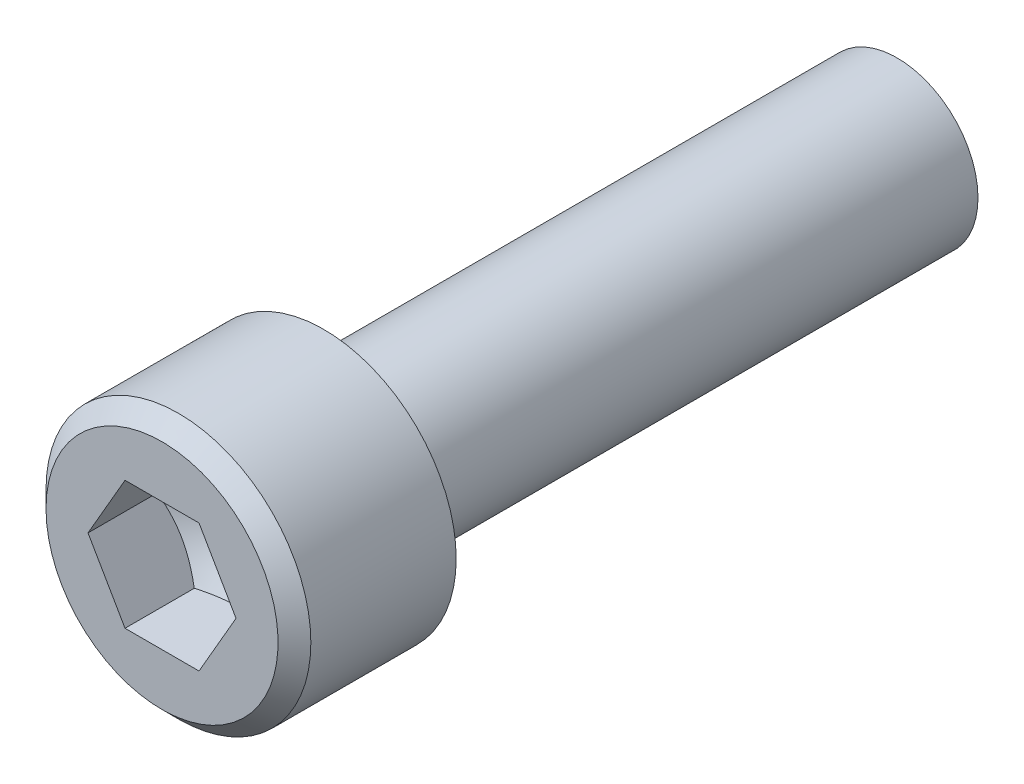
ISO-10303-21;
HEADER;
FILE_DESCRIPTION(('STEP AP214'),'2;1');
FILE_NAME('part.step','',(''),(''),'','','');
FILE_SCHEMA(('AUTOMOTIVE_DESIGN { 1 0 10303 214 1 1 1 1 }'));
ENDSEC;
DATA;
#1=APPLICATION_CONTEXT('core data for automotive mechanical design processes');
#2=APPLICATION_PROTOCOL_DEFINITION('international standard','automotive_design',2000,#1);
#3=PRODUCT_CONTEXT('',#1,'mechanical');
#4=PRODUCT('Part','Part','',(#3));
#5=PRODUCT_RELATED_PRODUCT_CATEGORY('part','',(#4));
#6=PRODUCT_DEFINITION_FORMATION('','',#4);
#7=PRODUCT_DEFINITION_CONTEXT('part definition',#1,'design');
#8=PRODUCT_DEFINITION('design','',#6,#7);
#9=PRODUCT_DEFINITION_SHAPE('','',#8);
#10=(LENGTH_UNIT() NAMED_UNIT(*) SI_UNIT(.MILLI.,.METRE.));
#11=(NAMED_UNIT(*) PLANE_ANGLE_UNIT() SI_UNIT($,.RADIAN.));
#12=(NAMED_UNIT(*) SI_UNIT($,.STERADIAN.) SOLID_ANGLE_UNIT());
#13=UNCERTAINTY_MEASURE_WITH_UNIT(LENGTH_MEASURE(1.E-05),#10,'distance_accuracy_value','');
#14=(GEOMETRIC_REPRESENTATION_CONTEXT(3) GLOBAL_UNCERTAINTY_ASSIGNED_CONTEXT((#13)) GLOBAL_UNIT_ASSIGNED_CONTEXT((#10,
#11,#12)) REPRESENTATION_CONTEXT('',''));
#15=CARTESIAN_POINT('',(0.,0.,0.));
#16=DIRECTION('',(0.,0.,1.));
#17=DIRECTION('',(1.,0.,0.));
#18=AXIS2_PLACEMENT_3D('',#15,#16,#17);
#19=CARTESIAN_POINT('',(0.,0.,2.00922230834522));
#20=DIRECTION('',(0.,0.,1.));
#21=DIRECTION('',(1.,0.,0.));
#22=AXIS2_PLACEMENT_3D('',#19,#20,#21);
#23=CONICAL_SURFACE('',#22,1.61357492368097,1.04719755087501);
#24=CARTESIAN_POINT('',(2.8421709430404E-10,0.,1.07762439154158));
#25=VERTEX_POINT('',#24);
#26=VERTEX_LOOP('',#25);
#27=FACE_BOUND('',#26,.T.);
#28=CARTESIAN_POINT('',(1.60395121657074,-3.93231474793354E-11,2.00366605844938));
#29=CARTESIAN_POINT('',(1.56870924553933,-0.0610408844234669,1.98331319876982));
#30=CARTESIAN_POINT('',(1.53316306631527,-0.122608672854032,1.96480333807968));
#31=CARTESIAN_POINT('',(1.46145524955302,-0.246810254785756,1.93249493217423));
#32=CARTESIAN_POINT('',(1.42529233832048,-0.309446254390246,1.91870781520045));
#33=CARTESIAN_POINT('',(1.35341466465201,-0.433942037113974,1.89724717363123));
#34=CARTESIAN_POINT('',(1.3177109584191,-0.495782670327861,1.88943079992379));
#35=CARTESIAN_POINT('',(1.24613563586373,-0.619754765561857,1.88010142592249));
#36=CARTESIAN_POINT('',(1.2102642795196,-0.681885777286307,1.87858069824715));
#37=CARTESIAN_POINT('',(1.14324250260154,-0.797970900121939,1.88175241126182));
#38=CARTESIAN_POINT('',(1.11208202485429,-0.851942430768299,1.88566609057269));
#39=CARTESIAN_POINT('',(1.04996406966594,-0.959533885216807,1.89806764845514));
#40=CARTESIAN_POINT('',(1.01900680691377,-1.01315343716683,1.90655975922655));
#41=CARTESIAN_POINT('',(0.95676088288778,-1.12096654014391,1.92778839251943));
#42=CARTESIAN_POINT('',(0.925480095698456,-1.17514645285657,1.94061485982978));
#43=CARTESIAN_POINT('',(0.863384939232534,-1.28269841875949,1.969725518207));
#44=CARTESIAN_POINT('',(0.832569775059317,-1.33607184875108,1.98600287382067));
#45=CARTESIAN_POINT('',(0.80197565801279,-1.38906241388837,2.00366602975904));
#46=B_SPLINE_CURVE_WITH_KNOTS('',3,(#28,#29,#30,#31,#32,#33,#34,#35,#36,#37,#38,#39,#40,#41,#42,
#43,#44,#45),.UNSPECIFIED.,.F.,.F.,(4,2,2,2,2,2,2,2,4),(0.,0.220177526699987,0.440884143066934,
0.656128954539437,0.871109492448446,1.05826264577515,1.24558909666037,1.43706954982027,
1.62817420783304),.UNSPECIFIED.);
#47=CARTESIAN_POINT('',(1.60395121651482,0.,2.00366605835819));
#48=VERTEX_POINT('',#47);
#49=CARTESIAN_POINT('',(0.801975633154503,-1.38906245694419,2.00366604411098));
#50=VERTEX_POINT('',#49);
#51=EDGE_CURVE('E21',#48,#50,#46,.T.);
#52=ORIENTED_EDGE('',*,*,#51,.F.);
#53=CARTESIAN_POINT('',(1.60395121657095,3.83074850435402E-11,2.00366605844988));
#54=CARTESIAN_POINT('',(1.56870924552077,0.0610408844553845,1.98331319875935));
#55=CARTESIAN_POINT('',(1.53316306627758,0.122608672919246,1.96480333806014));
#56=CARTESIAN_POINT('',(1.46145524947397,0.246810254922725,1.93249493214117));
#57=CARTESIAN_POINT('',(1.42529233821916,0.309446254565738,1.91870781516328));
#58=CARTESIAN_POINT('',(1.3534146645473,0.433942037295318,1.89724717360671));
#59=CARTESIAN_POINT('',(1.31771095833377,0.495782670475642,1.88943079990936));
#60=CARTESIAN_POINT('',(1.24613563582068,0.619754765636425,1.88010142592018));
#61=CARTESIAN_POINT('',(1.21026427949945,0.681885777321209,1.87858069824653));
#62=CARTESIAN_POINT('',(1.14324249767597,0.797970908653282,1.88175241149628));
#63=CARTESIAN_POINT('',(1.11208201501096,0.851942447817442,1.88566609181346));
#64=CARTESIAN_POINT('',(1.04996405006882,0.959533919160014,1.898067653093));
#65=CARTESIAN_POINT('',(1.0190067824808,1.01315347948597,1.90655976625848));
#66=CARTESIAN_POINT('',(0.956760848671186,1.12096659940879,1.92778840552082));
#67=CARTESIAN_POINT('',(0.925480056538882,1.17514652068294,1.94061487644981));
#68=CARTESIAN_POINT('',(0.863384890366848,1.28269850339733,1.9697255428513));
#69=CARTESIAN_POINT('',(0.832569721429848,1.33607194164004,1.98600290286582));
#70=CARTESIAN_POINT('',(0.80197559968634,1.38906251491274,2.00366606343383));
#71=B_SPLINE_CURVE_WITH_KNOTS('',3,(#53,#54,#55,#56,#57,#58,#59,#60,#61,#62,#63,#64,#65,#66,#67,
#68,#69,#70),.UNSPECIFIED.,.F.,.F.,(4,2,2,2,2,2,2,2,4),(0.,0.22017752681814,0.440884143318391,
0.656128954670925,0.871109492448965,1.05826267532404,1.24558915586695,1.43706964022464,
1.62817432919767),.UNSPECIFIED.);
#72=CARTESIAN_POINT('',(0.801975603520193,1.38906250827231,2.00366606122035));
#73=VERTEX_POINT('',#72);
#74=EDGE_CURVE('E78',#48,#73,#71,.T.);
#75=ORIENTED_EDGE('',*,*,#74,.T.);
#76=CARTESIAN_POINT('',(0.801975572332661,1.3890625,2.00366604808113));
#77=CARTESIAN_POINT('',(0.731491630827418,1.3890625,1.98331318923872));
#78=CARTESIAN_POINT('',(0.660399272939518,1.3890625,1.96480332944128));
#79=CARTESIAN_POINT('',(0.516983640587039,1.3890625,1.93249492539564));
#80=CARTESIAN_POINT('',(0.444657818734046,1.3890625,1.91870780938823));
#81=CARTESIAN_POINT('',(0.300902472702479,1.3890625,1.89724716975661));
#82=CARTESIAN_POINT('',(0.229495060928604,1.3890625,1.88943079701753));
#83=CARTESIAN_POINT('',(0.0863444172851924,1.3890625,1.88010142487821));
#84=CARTESIAN_POINT('',(0.0146017053721718,1.3890625,1.87858069809685));
#85=CARTESIAN_POINT('',(-0.119441855224592,1.3890625,1.88175241282815));
#86=CARTESIAN_POINT('',(-0.181762818246063,1.3890625,1.88566609362759));
#87=CARTESIAN_POINT('',(-0.305998743505769,1.3890625,1.89806765548551));
#88=CARTESIAN_POINT('',(-0.36791327636582,1.3890625,1.90655976874626));
#89=CARTESIAN_POINT('',(-0.492405139270699,1.3890625,1.92778840784305));
#90=CARTESIAN_POINT('',(-0.55496672113869,1.3890625,1.94061487849877));
#91=CARTESIAN_POINT('',(-0.679157048763347,1.3890625,1.96972554406884));
#92=CARTESIAN_POINT('',(-0.740787384314304,1.3890625,1.98600290352636));
#93=CARTESIAN_POINT('',(-0.801975625514881,1.3890625,2.00366606343352));
#94=B_SPLINE_CURVE_WITH_KNOTS('',3,(#76,#77,#78,#79,#80,#81,#82,#83,#84,#85,#86,#87,#88,#89,#90,
#91,#92,#93),.UNSPECIFIED.,.F.,.F.,(4,2,2,2,2,2,2,2,4),(0.,0.220177524395235,0.440884138409889,
0.656128947501183,0.871109483041436,1.05826265911873,1.24558913283762,1.43706961000139,
1.62817429182646),.UNSPECIFIED.);
#95=CARTESIAN_POINT('',(-0.801975617847664,1.38906249999999,2.00366606122018));
#96=VERTEX_POINT('',#95);
#97=EDGE_CURVE('E98',#73,#96,#94,.T.);
#98=ORIENTED_EDGE('',*,*,#97,.T.);
#99=CARTESIAN_POINT('',(-0.801975626276859,1.38906246885661,2.00366604808179));
#100=CARTESIAN_POINT('',(-0.837217597026695,1.32802158495904,1.98331318924093));
#101=CARTESIAN_POINT('',(-0.872763775967825,1.26645379701807,1.96480332944475));
#102=CARTESIAN_POINT('',(-0.944471592137982,1.14225221611155,1.93249492540098));
#103=CARTESIAN_POINT('',(-0.98063450306121,1.07961621704293,1.91870780939412));
#104=CARTESIAN_POINT('',(-1.05251217607654,0.955120435450554,1.8972471697605));
#105=CARTESIAN_POINT('',(-1.08821588196637,0.893279802830876,1.88943079701986));
#106=CARTESIAN_POINT('',(-1.15979120379438,0.769307708856671,1.88010142487863));
#107=CARTESIAN_POINT('',(-1.1956625597543,0.707176697797693,1.87858069809695));
#108=CARTESIAN_POINT('',(-1.26268433932696,0.591091570364156,1.88175241279337));
#109=CARTESIAN_POINT('',(-1.29384482011013,0.537120034459435,1.88566609344389));
#110=CARTESIAN_POINT('',(-1.35596278129694,0.429528569621292,1.89806765479912));
#111=CARTESIAN_POINT('',(-1.38692004701152,0.375909012540234,1.90655976770563));
#112=CARTESIAN_POINT('',(-1.4491659770165,0.268095899207226,1.92778840591918));
#113=CARTESIAN_POINT('',(-1.4804467672192,0.21391598127525,1.94061487603949));
#114=CARTESIAN_POINT('',(-1.54254192959554,0.106364005135186,1.96972554042232));
#115=CARTESIAN_POINT('',(-1.57335709666624,0.052990570125022,1.98600289922871));
#116=CARTESIAN_POINT('',(-1.60395121657162,3.60390743258956E-11,2.0036660584509));
#117=B_SPLINE_CURVE_WITH_KNOTS('',3,(#99,#100,#101,#102,#103,#104,#105,#106,#107,#108,#109,#110,
#111,#112,#113,#114,#115,#116),.UNSPECIFIED.,.F.,.F.,(4,2,2,2,2,2,2,2,4),(0.,0.220177524377925,
0.44088413837303,0.656128947482232,0.871109483042021,1.05826265474771,1.24558912407881,
1.43706959662696,1.62817427387154),.UNSPECIFIED.);
#118=CARTESIAN_POINT('',(-1.6039512166457,1.9447541062384E-11,2.0036660585319));
#119=VERTEX_POINT('',#118);
#120=EDGE_CURVE('E182',#96,#119,#117,.T.);
#121=ORIENTED_EDGE('',*,*,#120,.T.);
#122=CARTESIAN_POINT('',(-0.801975545805902,-1.38906253324149,2.00366610034259));
#123=CARTESIAN_POINT('',(-0.837217537376201,-1.32802166134192,1.98331322384176));
#124=CARTESIAN_POINT('',(-0.87276372600438,-1.26645387633831,1.96480335498118));
#125=CARTESIAN_POINT('',(-0.94447155170889,-1.14225229337312,1.93249494059084));
#126=CARTESIAN_POINT('',(-0.980634462454542,-1.07961628929142,1.91870782330784));
#127=CARTESIAN_POINT('',(-1.05251213761926,-0.955120500192236,1.89724717950107));
#128=CARTESIAN_POINT('',(-1.08821584576458,-0.893279865036186,1.88943080386541));
#129=CARTESIAN_POINT('',(-1.15979117156361,-0.769307765179402,1.88010142695925));
#130=CARTESIAN_POINT('',(-1.19566252924003,-0.707176750774704,1.87858069831366));
#131=CARTESIAN_POINT('',(-1.26268431290894,-0.59109161601293,1.88175241009377));
#132=CARTESIAN_POINT('',(-1.29384479603855,-0.537120076123378,1.8856660897217));
#133=CARTESIAN_POINT('',(-1.3559627618584,-0.429528603319139,1.89806764983324));
#134=CARTESIAN_POINT('',(-1.38692002985971,-0.375909042256496,1.90655976251606));
#135=CARTESIAN_POINT('',(-1.44916596465683,-0.268095920606171,1.92778840102818));
#136=CARTESIAN_POINT('',(-1.48044675736197,-0.213915998344158,1.94061487171226));
#137=CARTESIAN_POINT('',(-1.54254192470765,-0.106364013605571,1.96972553783737));
#138=CARTESIAN_POINT('',(-1.57335709424496,-0.0529905743274035,1.98600289782452));
#139=CARTESIAN_POINT('',(-1.60395121657306,-3.35539765183929E-11,2.00366605845173));
#140=B_SPLINE_CURVE_WITH_KNOTS('',3,(#122,#123,#124,#125,#126,#127,#128,#129,#130,#131,#132,
#133,#134,#135,#136,#137,#138,#139),.UNSPECIFIED.,.F.,.F.,(4,2,2,2,2,2,2,2,4),(0.,
0.220177537854373,0.440884164774706,0.656128984908661,0.871109531728061,1.0582627170637,
1.24558919990149,1.43706968745937,1.62817437987301),.UNSPECIFIED.);
#141=CARTESIAN_POINT('',(-0.801975558576624,-1.3890625,2.00366604411011));
#142=VERTEX_POINT('',#141);
#143=EDGE_CURVE('E113',#142,#119,#140,.T.);
#144=ORIENTED_EDGE('',*,*,#143,.F.);
#145=CARTESIAN_POINT('',(0.801975668386772,-1.38906246251616,2.00366610035026));
#146=CARTESIAN_POINT('',(0.731491726898217,-1.38906248653749,1.98331322386287));
#147=CARTESIAN_POINT('',(0.660399366748264,-1.38906249639182,1.96480335501092));
#148=CARTESIAN_POINT('',(0.516983727927585,-1.38906250361686,1.93249494063096));
#149=CARTESIAN_POINT('',(0.444657901866201,-1.3890625009575,1.91870782334943));
#150=CARTESIAN_POINT('',(0.300902548264839,-1.38906249906621,1.89724717952841));
#151=CARTESIAN_POINT('',(0.22949513312735,-1.38906249975108,1.88943080388271));
#152=CARTESIAN_POINT('',(0.0863444823182797,-1.38906250024862,1.88010142696317));
#153=CARTESIAN_POINT('',(0.0146017666031402,-1.38906250006235,1.87858069831449));
#154=CARTESIAN_POINT('',(-0.119441792581751,-1.38906249994573,1.88175240989152));
#155=CARTESIAN_POINT('',(-0.181762750395687,-1.38906249998537,1.88566608866109));
#156=CARTESIAN_POINT('',(-0.305998665370785,-1.38906250001465,1.89806764587691));
#157=CARTESIAN_POINT('',(-0.367913193154495,-1.38906250000423,1.90655975651957));
#158=CARTESIAN_POINT('',(-0.492405046098913,-1.38906249999569,1.92778838994541));
#159=CARTESIAN_POINT('',(-0.55496662308597,-1.38906249999785,1.94061485754653));
#160=CARTESIAN_POINT('',(-0.67915694123723,-1.38906250000216,1.96972551683563));
#161=CARTESIAN_POINT('',(-0.740787272193864,-1.3890625000043,1.98600287307382));
#162=CARTESIAN_POINT('',(-0.801975508857035,-1.3890625,2.0036660297573));
#163=B_SPLINE_CURVE_WITH_KNOTS('',3,(#145,#146,#147,#148,#149,#150,#151,#152,#153,#154,#155,
#156,#157,#158,#159,#160,#161,#162),.UNSPECIFIED.,.F.,.F.,(4,2,2,2,2,2,2,2,4),(0.,
0.220177537755136,0.440884164563677,0.656128984801755,0.871109531734508,1.0582626919045,
1.24558914948359,1.43706961047086,1.62817427651611),.UNSPECIFIED.);
#164=EDGE_CURVE('E81',#50,#142,#163,.T.);
#165=ORIENTED_EDGE('',*,*,#164,.F.);
#166=EDGE_LOOP('',(#52,#75,#98,#121,#144,#165));
#167=FACE_BOUND('',#166,.T.);
#168=ADVANCED_FACE('F17',(#27,#167),#23,.F.);
#169=CARTESIAN_POINT('',(-1.60395121659243,0.,-12.701));
#170=DIRECTION('',(-0.866025403784438,-0.5,0.));
#171=DIRECTION('',(0.5,-0.866025403784438,0.));
#172=AXIS2_PLACEMENT_3D('',#169,#170,#171);
#173=PLANE('',#172);
#174=ORIENTED_EDGE('',*,*,#143,.T.);
#175=DIRECTION('',(0.,0.,1.));
#176=VECTOR('',#175,1.);
#177=CARTESIAN_POINT('',(-1.60395121658915,5.67558153252712E-12,-12.701));
#178=LINE('',#177,#176);
#179=CARTESIAN_POINT('',(-1.60395121658915,5.67590679317886E-12,3.50520000000001));
#180=VERTEX_POINT('',#179);
#181=EDGE_CURVE('E158',#119,#180,#178,.T.);
#182=ORIENTED_EDGE('',*,*,#181,.T.);
#183=DIRECTION('',(0.5,-0.866025403784439,0.));
#184=VECTOR('',#183,1.);
#185=CARTESIAN_POINT('',(-1.60395121659243,0.,3.5052));
#186=LINE('',#185,#184);
#187=CARTESIAN_POINT('',(-0.801975608296548,-1.38906249999971,3.5052));
#188=VERTEX_POINT('',#187);
#189=EDGE_CURVE('E155',#180,#188,#186,.T.);
#190=ORIENTED_EDGE('',*,*,#189,.T.);
#191=DIRECTION('',(0.,0.,1.));
#192=VECTOR('',#191,1.);
#193=CARTESIAN_POINT('',(-0.801975608296213,-1.3890625,-12.701));
#194=LINE('',#193,#192);
#195=EDGE_CURVE('E138',#188,#142,#194,.F.);
#196=ORIENTED_EDGE('',*,*,#195,.T.);
#197=EDGE_LOOP('',(#174,#182,#190,#196));
#198=FACE_BOUND('',#197,.T.);
#199=ADVANCED_FACE('F129',(#198),#173,.F.);
#200=CARTESIAN_POINT('',(-0.801975608296214,-1.3890625,-12.701));
#201=DIRECTION('',(0.,-1.,0.));
#202=DIRECTION('',(1.,0.,0.));
#203=AXIS2_PLACEMENT_3D('',#200,#201,#202);
#204=PLANE('',#203);
#205=ORIENTED_EDGE('',*,*,#164,.T.);
#206=ORIENTED_EDGE('',*,*,#195,.F.);
#207=DIRECTION('',(-1.,0.,0.));
#208=VECTOR('',#207,1.);
#209=CARTESIAN_POINT('',(0.,-1.38906250000001,3.5052));
#210=LINE('',#209,#208);
#211=CARTESIAN_POINT('',(0.801975608295965,-1.38906250000044,3.50520000000001));
#212=VERTEX_POINT('',#211);
#213=EDGE_CURVE('E157',#188,#212,#210,.F.);
#214=ORIENTED_EDGE('',*,*,#213,.T.);
#215=DIRECTION('',(0.,0.,1.));
#216=VECTOR('',#215,1.);
#217=CARTESIAN_POINT('',(0.801975608296216,-1.3890625,-12.701));
#218=LINE('',#217,#216);
#219=EDGE_CURVE('E92',#212,#50,#218,.F.);
#220=ORIENTED_EDGE('',*,*,#219,.T.);
#221=EDGE_LOOP('',(#205,#206,#214,#220));
#222=FACE_BOUND('',#221,.T.);
#223=ADVANCED_FACE('F126',(#222),#204,.F.);
#224=CARTESIAN_POINT('',(0.801975608296216,-1.3890625,-12.701));
#225=DIRECTION('',(0.866025403784439,-0.5,0.));
#226=DIRECTION('',(0.5,0.866025403784439,0.));
#227=AXIS2_PLACEMENT_3D('',#224,#225,#226);
#228=PLANE('',#227);
#229=ORIENTED_EDGE('',*,*,#51,.T.);
#230=ORIENTED_EDGE('',*,*,#219,.F.);
#231=DIRECTION('',(0.499999999999999,0.866025403784439,0.));
#232=VECTOR('',#231,1.);
#233=CARTESIAN_POINT('',(0.801975608296216,-1.3890625,3.5052));
#234=LINE('',#233,#232);
#235=CARTESIAN_POINT('',(1.60395121659421,-3.08521780793347E-12,3.5052));
#236=VERTEX_POINT('',#235);
#237=EDGE_CURVE('E89',#212,#236,#234,.T.);
#238=ORIENTED_EDGE('',*,*,#237,.T.);
#239=DIRECTION('',(0.,0.,1.));
#240=VECTOR('',#239,1.);
#241=CARTESIAN_POINT('',(1.60395121659243,0.,-12.701));
#242=LINE('',#241,#240);
#243=EDGE_CURVE('E86',#236,#48,#242,.F.);
#244=ORIENTED_EDGE('',*,*,#243,.T.);
#245=EDGE_LOOP('',(#229,#230,#238,#244));
#246=FACE_BOUND('',#245,.T.);
#247=ADVANCED_FACE('F87',(#246),#228,.F.);
#248=CARTESIAN_POINT('',(1.60395121659243,0.,-12.701));
#249=DIRECTION('',(0.866025403784438,0.5,0.));
#250=DIRECTION('',(-0.5,0.866025403784438,0.));
#251=AXIS2_PLACEMENT_3D('',#248,#249,#250);
#252=PLANE('',#251);
#253=ORIENTED_EDGE('',*,*,#74,.F.);
#254=ORIENTED_EDGE('',*,*,#243,.F.);
#255=DIRECTION('',(-0.5,0.866025403784438,0.));
#256=VECTOR('',#255,1.);
#257=CARTESIAN_POINT('',(1.60395121659243,0.,3.5052));
#258=LINE('',#257,#256);
#259=CARTESIAN_POINT('',(0.8019756051891,1.3890625,3.5052));
#260=VERTEX_POINT('',#259);
#261=EDGE_CURVE('E162',#236,#260,#258,.T.);
#262=ORIENTED_EDGE('',*,*,#261,.T.);
#263=DIRECTION('',(0.,0.,1.));
#264=VECTOR('',#263,1.);
#265=CARTESIAN_POINT('',(0.801975608296215,1.3890625,-12.701));
#266=LINE('',#265,#264);
#267=EDGE_CURVE('E95',#260,#73,#266,.F.);
#268=ORIENTED_EDGE('',*,*,#267,.T.);
#269=EDGE_LOOP('',(#253,#254,#262,#268));
#270=FACE_BOUND('',#269,.T.);
#271=ADVANCED_FACE('F94',(#270),#252,.F.);
#272=CARTESIAN_POINT('',(0.801975608296215,1.3890625,-12.701));
#273=DIRECTION('',(0.,1.,0.));
#274=DIRECTION('',(0.,0.,1.));
#275=AXIS2_PLACEMENT_3D('',#272,#273,#274);
#276=PLANE('',#275);
#277=ORIENTED_EDGE('',*,*,#97,.F.);
#278=ORIENTED_EDGE('',*,*,#267,.F.);
#279=DIRECTION('',(-1.,0.,0.));
#280=VECTOR('',#279,1.);
#281=CARTESIAN_POINT('',(0.,1.3890625,3.5052));
#282=LINE('',#281,#280);
#283=CARTESIAN_POINT('',(-0.801975609849683,1.38906249730931,3.50520000000001));
#284=VERTEX_POINT('',#283);
#285=EDGE_CURVE('E41',#260,#284,#282,.T.);
#286=ORIENTED_EDGE('',*,*,#285,.T.);
#287=DIRECTION('',(0.,0.,1.));
#288=VECTOR('',#287,1.);
#289=CARTESIAN_POINT('',(-0.801975608296228,1.38906249999998,-12.701));
#290=LINE('',#289,#288);
#291=EDGE_CURVE('E187',#284,#96,#290,.F.);
#292=ORIENTED_EDGE('',*,*,#291,.T.);
#293=EDGE_LOOP('',(#277,#278,#286,#292));
#294=FACE_BOUND('',#293,.T.);
#295=ADVANCED_FACE('F120',(#294),#276,.F.);
#296=CARTESIAN_POINT('',(-0.801975608296216,1.3890625,-12.701));
#297=DIRECTION('',(-0.866025403784439,0.5,0.));
#298=DIRECTION('',(-0.5,-0.866025403784439,0.));
#299=AXIS2_PLACEMENT_3D('',#296,#297,#298);
#300=PLANE('',#299);
#301=ORIENTED_EDGE('',*,*,#120,.F.);
#302=ORIENTED_EDGE('',*,*,#291,.F.);
#303=DIRECTION('',(-0.499999999999999,-0.866025403784439,0.));
#304=VECTOR('',#303,1.);
#305=CARTESIAN_POINT('',(-0.801975608296228,1.38906249999998,3.5052));
#306=LINE('',#305,#304);
#307=EDGE_CURVE('E149',#284,#180,#306,.T.);
#308=ORIENTED_EDGE('',*,*,#307,.T.);
#309=ORIENTED_EDGE('',*,*,#181,.F.);
#310=EDGE_LOOP('',(#301,#302,#308,#309));
#311=FACE_BOUND('',#310,.T.);
#312=ADVANCED_FACE('F188',(#311),#300,.F.);
#313=CARTESIAN_POINT('',(0.,1.3890625,3.5052));
#314=DIRECTION('',(0.,0.,-1.));
#315=DIRECTION('',(-1.,0.,0.));
#316=AXIS2_PLACEMENT_3D('',#313,#314,#315);
#317=PLANE('',#316);
#318=ORIENTED_EDGE('',*,*,#285,.F.);
#319=ORIENTED_EDGE('',*,*,#261,.F.);
#320=ORIENTED_EDGE('',*,*,#237,.F.);
#321=ORIENTED_EDGE('',*,*,#213,.F.);
#322=ORIENTED_EDGE('',*,*,#189,.F.);
#323=ORIENTED_EDGE('',*,*,#307,.F.);
#324=EDGE_LOOP('',(#318,#319,#320,#321,#322,#323));
#325=FACE_BOUND('',#324,.T.);
#326=CARTESIAN_POINT('',(0.,0.,3.50519999994958));
#327=DIRECTION('',(0.,0.,-1.));
#328=DIRECTION('',(-1.,0.,0.));
#329=AXIS2_PLACEMENT_3D('',#326,#327,#328);
#330=CIRCLE('',#329,2.51460000004045);
#331=CARTESIAN_POINT('',(-2.51460000004045,0.,3.50519999994958));
#332=VERTEX_POINT('',#331);
#333=EDGE_CURVE('E152',#332,#332,#330,.T.);
#334=ORIENTED_EDGE('',*,*,#333,.F.);
#335=EDGE_LOOP('',(#334));
#336=FACE_BOUND('',#335,.T.);
#337=ADVANCED_FACE('F192',(#325,#336),#317,.F.);
#338=CARTESIAN_POINT('',(0.,0.,3.14960000008568));
#339=DIRECTION('',(0.,0.,-1.));
#340=DIRECTION('',(-1.,0.,0.));
#341=AXIS2_PLACEMENT_3D('',#338,#339,#340);
#342=CONICAL_SURFACE('',#341,2.87019999990434,0.785398163397448);
#343=CARTESIAN_POINT('',(0.,0.,3.14959999999997));
#344=DIRECTION('',(0.,0.,1.));
#345=DIRECTION('',(1.,0.,0.));
#346=AXIS2_PLACEMENT_3D('',#343,#344,#345);
#347=CIRCLE('',#346,2.8702);
#348=CARTESIAN_POINT('',(2.8702,0.,3.14959999999997));
#349=VERTEX_POINT('',#348);
#350=EDGE_CURVE('E180',#349,#349,#347,.F.);
#351=ORIENTED_EDGE('',*,*,#350,.F.);
#352=EDGE_LOOP('',(#351));
#353=FACE_BOUND('',#352,.T.);
#354=ORIENTED_EDGE('',*,*,#333,.T.);
#355=EDGE_LOOP('',(#354));
#356=FACE_BOUND('',#355,.T.);
#357=ADVANCED_FACE('F196',(#353,#356),#342,.T.);
#358=CARTESIAN_POINT('',(0.,0.,1000.));
#359=DIRECTION('',(0.,0.,1.));
#360=DIRECTION('',(1.,0.,0.));
#361=AXIS2_PLACEMENT_3D('',#358,#359,#360);
#362=CYLINDRICAL_SURFACE('',#361,2.8702);
#363=ORIENTED_EDGE('',*,*,#350,.T.);
#364=EDGE_LOOP('',(#363));
#365=FACE_BOUND('',#364,.T.);
#366=CARTESIAN_POINT('',(0.,0.,0.));
#367=DIRECTION('',(0.,0.,1.));
#368=DIRECTION('',(1.,0.,0.));
#369=AXIS2_PLACEMENT_3D('',#366,#367,#368);
#370=CIRCLE('',#369,2.8702);
#371=CARTESIAN_POINT('',(2.8702,0.,0.));
#372=VERTEX_POINT('',#371);
#373=EDGE_CURVE('E177',#372,#372,#370,.T.);
#374=ORIENTED_EDGE('',*,*,#373,.T.);
#375=EDGE_LOOP('',(#374));
#376=FACE_BOUND('',#375,.T.);
#377=ADVANCED_FACE('F200',(#365,#376),#362,.T.);
#378=CARTESIAN_POINT('',(0.,1.28016,-12.7));
#379=DIRECTION('',(0.,0.,1.));
#380=DIRECTION('',(1.,0.,0.));
#381=AXIS2_PLACEMENT_3D('',#378,#379,#380);
#382=PLANE('',#381);
#383=CARTESIAN_POINT('',(0.,0.,-12.7000000000193));
#384=DIRECTION('',(0.,0.,1.));
#385=DIRECTION('',(0.,-1.,0.));
#386=AXIS2_PLACEMENT_3D('',#383,#384,#385);
#387=CIRCLE('',#386,1.28015999990794);
#388=CARTESIAN_POINT('',(0.,-1.28015999990794,-12.7000000000193));
#389=VERTEX_POINT('',#388);
#390=EDGE_CURVE('E174',#389,#389,#387,.T.);
#391=ORIENTED_EDGE('',*,*,#390,.F.);
#392=EDGE_LOOP('',(#391));
#393=FACE_BOUND('',#392,.T.);
#394=ADVANCED_FACE('F204',(#393),#382,.F.);
#395=CARTESIAN_POINT('',(0.,2.8702,0.));
#396=DIRECTION('',(0.,0.,1.));
#397=DIRECTION('',(1.,0.,0.));
#398=AXIS2_PLACEMENT_3D('',#395,#396,#397);
#399=PLANE('',#398);
#400=CARTESIAN_POINT('',(0.,0.,0.));
#401=DIRECTION('',(0.,0.,1.));
#402=DIRECTION('',(1.,0.,0.));
#403=AXIS2_PLACEMENT_3D('',#400,#401,#402);
#404=CIRCLE('',#403,1.7526);
#405=CARTESIAN_POINT('',(1.7526,0.,0.));
#406=VERTEX_POINT('',#405);
#407=EDGE_CURVE('E11',#406,#406,#404,.F.);
#408=ORIENTED_EDGE('',*,*,#407,.F.);
#409=EDGE_LOOP('',(#408));
#410=FACE_BOUND('',#409,.T.);
#411=ORIENTED_EDGE('',*,*,#373,.F.);
#412=EDGE_LOOP('',(#411));
#413=FACE_BOUND('',#412,.T.);
#414=ADVANCED_FACE('F208',(#410,#413),#399,.F.);
#415=CARTESIAN_POINT('',(0.,0.,-12.4272366387004));
#416=DIRECTION('',(0.,0.,1.));
#417=DIRECTION('',(0.,-1.,0.));
#418=AXIS2_PLACEMENT_3D('',#415,#416,#417);
#419=CONICAL_SURFACE('',#418,1.75260000014532,1.04719755118721);
#420=CARTESIAN_POINT('',(0.,0.,-12.4272366388241));
#421=DIRECTION('',(0.,0.,1.));
#422=DIRECTION('',(1.,0.,0.));
#423=AXIS2_PLACEMENT_3D('',#420,#421,#422);
#424=CIRCLE('',#423,1.7526);
#425=CARTESIAN_POINT('',(1.7526,0.,-12.4272366388241));
#426=VERTEX_POINT('',#425);
#427=EDGE_CURVE('E32',#426,#426,#424,.T.);
#428=ORIENTED_EDGE('',*,*,#427,.F.);
#429=EDGE_LOOP('',(#428));
#430=FACE_BOUND('',#429,.T.);
#431=ORIENTED_EDGE('',*,*,#390,.T.);
#432=EDGE_LOOP('',(#431));
#433=FACE_BOUND('',#432,.T.);
#434=ADVANCED_FACE('F212',(#430,#433),#419,.T.);
#435=CARTESIAN_POINT('',(0.,0.,1000.));
#436=DIRECTION('',(0.,0.,1.));
#437=DIRECTION('',(1.,0.,0.));
#438=AXIS2_PLACEMENT_3D('',#435,#436,#437);
#439=CYLINDRICAL_SURFACE('',#438,1.7526);
#440=ORIENTED_EDGE('',*,*,#407,.T.);
#441=EDGE_LOOP('',(#440));
#442=FACE_BOUND('',#441,.T.);
#443=ORIENTED_EDGE('',*,*,#427,.T.);
#444=EDGE_LOOP('',(#443));
#445=FACE_BOUND('',#444,.T.);
#446=ADVANCED_FACE('F216',(#442,#445),#439,.T.);
#447=CLOSED_SHELL('',(#168,#199,#223,#247,#271,#295,#312,#337,#357,#377,#394,#414,#434,#446));
#448=MANIFOLD_SOLID_BREP('B1',#447);
#449=ADVANCED_BREP_SHAPE_REPRESENTATION('',(#18,#448),#14);
#450=SHAPE_DEFINITION_REPRESENTATION(#9,#449);
ENDSEC;
END-ISO-10303-21;
